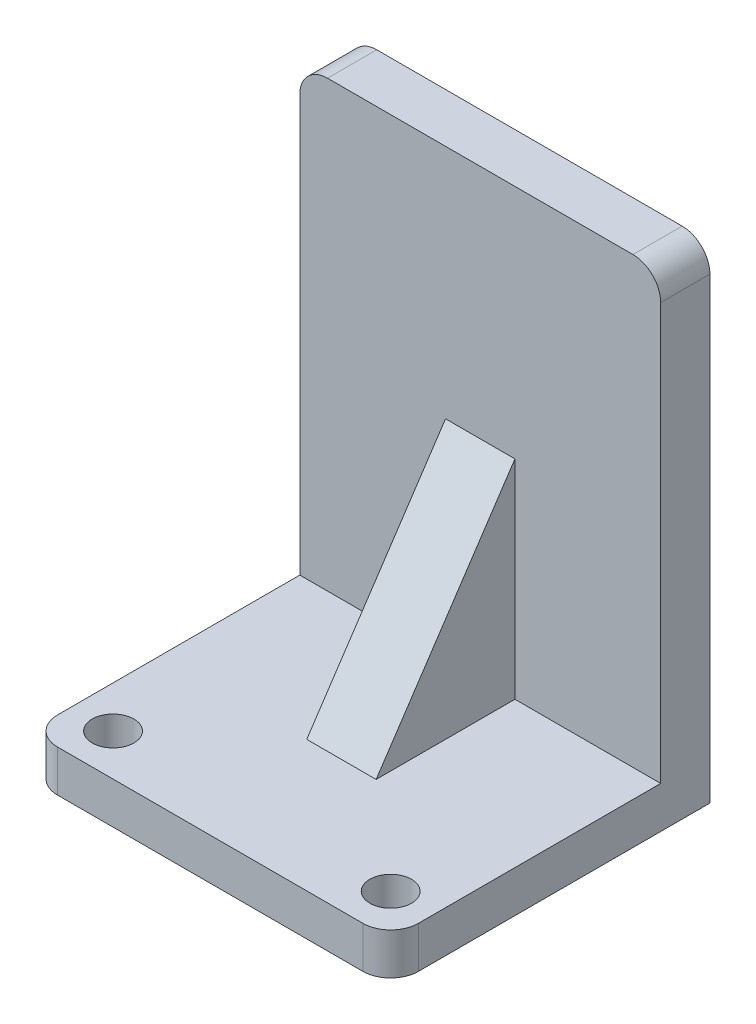
ISO-10303-21;
HEADER;
FILE_DESCRIPTION(('STEP AP214'),'2;1');
FILE_NAME('part.step','',(''),(''),'','','');
FILE_SCHEMA(('AUTOMOTIVE_DESIGN { 1 0 10303 214 1 1 1 1 }'));
ENDSEC;
DATA;
#1=APPLICATION_CONTEXT('core data for automotive mechanical design processes');
#2=APPLICATION_PROTOCOL_DEFINITION('international standard','automotive_design',2000,#1);
#3=PRODUCT_CONTEXT('',#1,'mechanical');
#4=PRODUCT('Part','Part','',(#3));
#5=PRODUCT_RELATED_PRODUCT_CATEGORY('part','',(#4));
#6=PRODUCT_DEFINITION_FORMATION('','',#4);
#7=PRODUCT_DEFINITION_CONTEXT('part definition',#1,'design');
#8=PRODUCT_DEFINITION('design','',#6,#7);
#9=PRODUCT_DEFINITION_SHAPE('','',#8);
#10=(LENGTH_UNIT() NAMED_UNIT(*) SI_UNIT(.MILLI.,.METRE.));
#11=(NAMED_UNIT(*) PLANE_ANGLE_UNIT() SI_UNIT($,.RADIAN.));
#12=(NAMED_UNIT(*) SI_UNIT($,.STERADIAN.) SOLID_ANGLE_UNIT());
#13=UNCERTAINTY_MEASURE_WITH_UNIT(LENGTH_MEASURE(1.E-05),#10,'distance_accuracy_value','');
#14=(GEOMETRIC_REPRESENTATION_CONTEXT(3) GLOBAL_UNCERTAINTY_ASSIGNED_CONTEXT((#13)) GLOBAL_UNIT_ASSIGNED_CONTEXT((#10,
#11,#12)) REPRESENTATION_CONTEXT('',''));
#15=CARTESIAN_POINT('',(0.,0.,0.));
#16=DIRECTION('',(0.,0.,1.));
#17=DIRECTION('',(1.,0.,0.));
#18=AXIS2_PLACEMENT_3D('',#15,#16,#17);
#19=CARTESIAN_POINT('',(11.0000000000015,3.,10.5000000000013));
#20=DIRECTION('',(0.,-1.00000000000007,0.));
#21=DIRECTION('',(0.,0.,-1.00000000000007));
#22=AXIS2_PLACEMENT_3D('',#19,#20,#21);
#23=PLANE('',#22);
#24=DIRECTION('',(-1.,0.,0.));
#25=VECTOR('',#24,1.);
#26=CARTESIAN_POINT('',(13.0000000000008,3.,-6.95354154770786));
#27=LINE('',#26,#25);
#28=CARTESIAN_POINT('',(13.0000000000008,3.,-6.95354154770786));
#29=VERTEX_POINT('',#28);
#30=CARTESIAN_POINT('',(2.50000000000178,2.99999999999578,-6.95354154770822));
#31=VERTEX_POINT('',#30);
#32=EDGE_CURVE('E145',#29,#31,#27,.T.);
#33=ORIENTED_EDGE('',*,*,#32,.T.);
#34=DIRECTION('',(0.,0.,1.00000000000007));
#35=VECTOR('',#34,1.);
#36=CARTESIAN_POINT('',(2.50000000000178,2.99999999999578,-6.95354154770822));
#37=LINE('',#36,#35);
#38=CARTESIAN_POINT('',(2.50000000000089,2.99999999999823,3.0464584522921));
#39=VERTEX_POINT('',#38);
#40=EDGE_CURVE('E131',#31,#39,#37,.T.);
#41=ORIENTED_EDGE('',*,*,#40,.T.);
#42=DIRECTION('',(-1.,0.,0.));
#43=VECTOR('',#42,1.);
#44=CARTESIAN_POINT('',(2.50000000000089,2.99999999999823,3.0464584522921));
#45=LINE('',#44,#43);
#46=CARTESIAN_POINT('',(-2.5,3.00000000000089,3.0464584522921));
#47=VERTEX_POINT('',#46);
#48=EDGE_CURVE('E318',#39,#47,#45,.T.);
#49=ORIENTED_EDGE('',*,*,#48,.T.);
#50=DIRECTION('',(0.,0.,1.00000000000007));
#51=VECTOR('',#50,1.);
#52=CARTESIAN_POINT('',(-2.49999999999995,2.99999999999845,-6.95354154770788));
#53=LINE('',#52,#51);
#54=CARTESIAN_POINT('',(-2.49999999999995,2.99999999999845,-6.95354154770788));
#55=VERTEX_POINT('',#54);
#56=EDGE_CURVE('E328',#55,#47,#53,.T.);
#57=ORIENTED_EDGE('',*,*,#56,.F.);
#58=CARTESIAN_POINT('',(-13.,2.99999999999734,-6.95354154770867));
#59=VERTEX_POINT('',#58);
#60=EDGE_CURVE('E158',#55,#59,#27,.T.);
#61=ORIENTED_EDGE('',*,*,#60,.T.);
#62=DIRECTION('',(0.,0.,1.00000000000007));
#63=VECTOR('',#62,1.);
#64=CARTESIAN_POINT('',(-13.,2.99999999999578,-10.5000000000007));
#65=LINE('',#64,#63);
#66=CARTESIAN_POINT('',(-12.9999999999971,3.,10.5000000000011));
#67=VERTEX_POINT('',#66);
#68=EDGE_CURVE('E191',#59,#67,#65,.T.);
#69=ORIENTED_EDGE('',*,*,#68,.T.);
#70=CARTESIAN_POINT('',(-10.9999999999971,3.,10.5000000000011));
#71=DIRECTION('',(0.,1.00000000000007,0.));
#72=DIRECTION('',(0.,0.,-1.00000000000007));
#73=AXIS2_PLACEMENT_3D('',#70,#71,#72);
#74=CIRCLE('',#73,2.);
#75=CARTESIAN_POINT('',(-10.9999999999992,3.,12.5000000000013));
#76=VERTEX_POINT('',#75);
#77=EDGE_CURVE('E195',#67,#76,#74,.T.);
#78=ORIENTED_EDGE('',*,*,#77,.T.);
#79=DIRECTION('',(1.,0.,0.));
#80=VECTOR('',#79,1.);
#81=CARTESIAN_POINT('',(11.0000000000018,2.99999999999906,12.5000000000014));
#82=LINE('',#81,#80);
#83=CARTESIAN_POINT('',(11.0000000000018,2.99999999999906,12.5000000000014));
#84=VERTEX_POINT('',#83);
#85=EDGE_CURVE('E198',#76,#84,#82,.T.);
#86=ORIENTED_EDGE('',*,*,#85,.T.);
#87=CARTESIAN_POINT('',(11.0000000000015,3.,10.5000000000013));
#88=DIRECTION('',(0.,1.00000000000007,0.));
#89=DIRECTION('',(0.,0.,-1.00000000000007));
#90=AXIS2_PLACEMENT_3D('',#87,#88,#89);
#91=CIRCLE('',#90,2.);
#92=CARTESIAN_POINT('',(13.0000000000015,3.00000000000267,10.5000000000022));
#93=VERTEX_POINT('',#92);
#94=EDGE_CURVE('E201',#84,#93,#91,.T.);
#95=ORIENTED_EDGE('',*,*,#94,.T.);
#96=DIRECTION('',(0.,0.,-1.00000000000007));
#97=VECTOR('',#96,1.);
#98=CARTESIAN_POINT('',(13.0000000000008,3.,-10.5000000000004));
#99=LINE('',#98,#97);
#100=EDGE_CURVE('E155',#93,#29,#99,.T.);
#101=ORIENTED_EDGE('',*,*,#100,.T.);
#102=EDGE_LOOP('',(#33,#41,#49,#57,#61,#69,#78,#86,#95,#101));
#103=FACE_BOUND('',#102,.T.);
#104=CARTESIAN_POINT('',(-9.99999999999834,3.00000000000267,9.50000000000052));
#105=DIRECTION('',(0.,1.00000000000007,0.));
#106=DIRECTION('',(0.,0.,1.00000000000007));
#107=AXIS2_PLACEMENT_3D('',#104,#105,#106);
#108=CIRCLE('',#107,1.5);
#109=CARTESIAN_POINT('',(-9.99999999999832,3.00000000000266,11.0000000000006));
#110=VERTEX_POINT('',#109);
#111=EDGE_CURVE('E181',#110,#110,#108,.T.);
#112=ORIENTED_EDGE('',*,*,#111,.F.);
#113=EDGE_LOOP('',(#112));
#114=FACE_BOUND('',#113,.T.);
#115=CARTESIAN_POINT('',(10.0000000000018,3.,9.50000000000129));
#116=DIRECTION('',(0.,1.00000000000007,0.));
#117=DIRECTION('',(0.,0.,1.00000000000007));
#118=AXIS2_PLACEMENT_3D('',#115,#116,#117);
#119=CIRCLE('',#118,1.5);
#120=CARTESIAN_POINT('',(10.0000000000018,2.99999999999999,11.0000000000014));
#121=VERTEX_POINT('',#120);
#122=EDGE_CURVE('E164',#121,#121,#119,.T.);
#123=ORIENTED_EDGE('',*,*,#122,.F.);
#124=EDGE_LOOP('',(#123));
#125=FACE_BOUND('',#124,.T.);
#126=ADVANCED_FACE('F36',(#103,#114,#125),#23,.F.);
#127=CARTESIAN_POINT('',(11.0000000000008,0.,10.5000000000012));
#128=DIRECTION('',(0.,-1.00000000000007,0.));
#129=DIRECTION('',(0.,0.,-1.00000000000007));
#130=AXIS2_PLACEMENT_3D('',#127,#128,#129);
#131=PLANE('',#130);
#132=CARTESIAN_POINT('',(-9.99999999999995,8.88178419700125E-13,9.50000000000068));
#133=DIRECTION('',(0.,1.00000000000007,0.));
#134=DIRECTION('',(0.,0.,1.00000000000007));
#135=AXIS2_PLACEMENT_3D('',#132,#133,#134);
#136=CIRCLE('',#135,1.5);
#137=CARTESIAN_POINT('',(-9.99999999999993,8.79284492438791E-13,11.0000000000008));
#138=VERTEX_POINT('',#137);
#139=EDGE_CURVE('E179',#138,#138,#136,.T.);
#140=ORIENTED_EDGE('',*,*,#139,.T.);
#141=EDGE_LOOP('',(#140));
#142=FACE_BOUND('',#141,.T.);
#143=DIRECTION('',(0.,0.,-1.00000000000007));
#144=VECTOR('',#143,1.);
#145=CARTESIAN_POINT('',(13.,0.,-10.5000000000006));
#146=LINE('',#145,#144);
#147=CARTESIAN_POINT('',(13.0000000000008,2.66453525910038E-12,10.5000000000019));
#148=VERTEX_POINT('',#147);
#149=CARTESIAN_POINT('',(13.,0.,-10.5000000000006));
#150=VERTEX_POINT('',#149);
#151=EDGE_CURVE('E185',#148,#150,#146,.T.);
#152=ORIENTED_EDGE('',*,*,#151,.F.);
#153=CARTESIAN_POINT('',(11.0000000000008,0.,10.5000000000012));
#154=DIRECTION('',(0.,1.00000000000007,0.));
#155=DIRECTION('',(0.,0.,-1.00000000000007));
#156=AXIS2_PLACEMENT_3D('',#153,#154,#155);
#157=CIRCLE('',#156,2.);
#158=CARTESIAN_POINT('',(11.0000000000009,-9.43689570931383E-13,12.5000000000013));
#159=VERTEX_POINT('',#158);
#160=EDGE_CURVE('E192',#159,#148,#157,.T.);
#161=ORIENTED_EDGE('',*,*,#160,.F.);
#162=DIRECTION('',(1.,0.,0.));
#163=VECTOR('',#162,1.);
#164=CARTESIAN_POINT('',(11.0000000000009,-9.43689570931383E-13,12.5000000000013));
#165=LINE('',#164,#163);
#166=CARTESIAN_POINT('',(-11.,0.,12.5000000000014));
#167=VERTEX_POINT('',#166);
#168=EDGE_CURVE('E218',#167,#159,#165,.T.);
#169=ORIENTED_EDGE('',*,*,#168,.F.);
#170=CARTESIAN_POINT('',(-10.9999999999983,0.,10.5000000000014));
#171=DIRECTION('',(0.,1.00000000000007,0.));
#172=DIRECTION('',(0.,0.,-1.00000000000007));
#173=AXIS2_PLACEMENT_3D('',#170,#171,#172);
#174=CIRCLE('',#173,2.);
#175=CARTESIAN_POINT('',(-12.9999999999983,0.,10.5000000000016));
#176=VERTEX_POINT('',#175);
#177=EDGE_CURVE('E215',#176,#167,#174,.T.);
#178=ORIENTED_EDGE('',*,*,#177,.F.);
#179=DIRECTION('',(0.,0.,1.00000000000007));
#180=VECTOR('',#179,1.);
#181=CARTESIAN_POINT('',(-13.0000000000017,-4.21884749357559E-12,-10.5000000000004));
#182=LINE('',#181,#180);
#183=CARTESIAN_POINT('',(-13.0000000000017,-4.21884749357559E-12,-10.5000000000004));
#184=VERTEX_POINT('',#183);
#185=EDGE_CURVE('E212',#184,#176,#182,.T.);
#186=ORIENTED_EDGE('',*,*,#185,.F.);
#187=DIRECTION('',(-1.,0.,0.));
#188=VECTOR('',#187,1.);
#189=CARTESIAN_POINT('',(13.,0.,-10.5000000000006));
#190=LINE('',#189,#188);
#191=EDGE_CURVE('E208',#150,#184,#190,.T.);
#192=ORIENTED_EDGE('',*,*,#191,.F.);
#193=EDGE_LOOP('',(#152,#161,#169,#178,#186,#192));
#194=FACE_BOUND('',#193,.T.);
#195=CARTESIAN_POINT('',(10.0000000000009,0.,9.50000000000142));
#196=DIRECTION('',(0.,1.00000000000007,0.));
#197=DIRECTION('',(0.,0.,1.00000000000007));
#198=AXIS2_PLACEMENT_3D('',#195,#196,#197);
#199=CIRCLE('',#198,1.5);
#200=CARTESIAN_POINT('',(10.0000000000009,0.,11.0000000000015));
#201=VERTEX_POINT('',#200);
#202=EDGE_CURVE('E157',#201,#201,#199,.T.);
#203=ORIENTED_EDGE('',*,*,#202,.T.);
#204=EDGE_LOOP('',(#203));
#205=FACE_BOUND('',#204,.T.);
#206=ADVANCED_FACE('F349',(#142,#194,#205),#131,.T.);
#207=CARTESIAN_POINT('',(13.0000000000008,3.,-10.5000000000004));
#208=DIRECTION('',(-1.,0.,0.));
#209=DIRECTION('',(0.,0.,1.00000000000007));
#210=AXIS2_PLACEMENT_3D('',#207,#208,#209);
#211=PLANE('',#210);
#212=DIRECTION('',(0.,-1.00000000000007,0.));
#213=VECTOR('',#212,1.);
#214=CARTESIAN_POINT('',(13.0000000000008,3.,-10.5000000000004));
#215=LINE('',#214,#213);
#216=CARTESIAN_POINT('',(13.,32.9999999999993,-10.5000000000004));
#217=VERTEX_POINT('',#216);
#218=EDGE_CURVE('E241',#217,#150,#215,.T.);
#219=ORIENTED_EDGE('',*,*,#218,.F.);
#220=DIRECTION('',(0.,0.,-1.00000000000007));
#221=VECTOR('',#220,1.);
#222=CARTESIAN_POINT('',(13.,33.,-6.95354154770762));
#223=LINE('',#222,#221);
#224=CARTESIAN_POINT('',(13.,33.,-6.95354154770762));
#225=VERTEX_POINT('',#224);
#226=EDGE_CURVE('E45',#217,#225,#223,.F.);
#227=ORIENTED_EDGE('',*,*,#226,.T.);
#228=DIRECTION('',(0.,1.00000000000007,0.));
#229=VECTOR('',#228,1.);
#230=CARTESIAN_POINT('',(13.0000000000008,3.,-6.95354154770786));
#231=LINE('',#230,#229);
#232=EDGE_CURVE('E176',#29,#225,#231,.T.);
#233=ORIENTED_EDGE('',*,*,#232,.F.);
#234=ORIENTED_EDGE('',*,*,#100,.F.);
#235=DIRECTION('',(0.,-1.00000000000007,0.));
#236=VECTOR('',#235,1.);
#237=CARTESIAN_POINT('',(13.0000000000015,3.00000000000267,10.5000000000022));
#238=LINE('',#237,#236);
#239=EDGE_CURVE('E204',#93,#148,#238,.T.);
#240=ORIENTED_EDGE('',*,*,#239,.T.);
#241=ORIENTED_EDGE('',*,*,#151,.T.);
#242=EDGE_LOOP('',(#219,#227,#233,#234,#240,#241));
#243=FACE_BOUND('',#242,.T.);
#244=ADVANCED_FACE('F354',(#243),#211,.F.);
#245=CARTESIAN_POINT('',(13.0000000000008,3.,-10.5000000000004));
#246=DIRECTION('',(0.,0.,1.00000000000007));
#247=DIRECTION('',(1.,0.,0.));
#248=AXIS2_PLACEMENT_3D('',#245,#246,#247);
#249=PLANE('',#248);
#250=DIRECTION('',(-1.,0.,0.));
#251=VECTOR('',#250,1.);
#252=CARTESIAN_POINT('',(13.000000000001,35.0000000000018,-10.5000000000006));
#253=LINE('',#252,#251);
#254=CARTESIAN_POINT('',(11.000000000001,35.0000000000018,-10.5));
#255=VERTEX_POINT('',#254);
#256=CARTESIAN_POINT('',(-10.9999999999992,35.0000000000018,-10.5000000000005));
#257=VERTEX_POINT('',#256);
#258=EDGE_CURVE('E166',#255,#257,#253,.T.);
#259=ORIENTED_EDGE('',*,*,#258,.F.);
#260=CARTESIAN_POINT('',(11.,33.0000000000009,-10.5000000000001));
#261=DIRECTION('',(0.,0.,1.00000000000007));
#262=DIRECTION('',(1.,0.,0.));
#263=AXIS2_PLACEMENT_3D('',#260,#261,#262);
#264=CIRCLE('',#263,2.);
#265=EDGE_CURVE('E59',#255,#217,#264,.F.);
#266=ORIENTED_EDGE('',*,*,#265,.T.);
#267=ORIENTED_EDGE('',*,*,#218,.T.);
#268=ORIENTED_EDGE('',*,*,#191,.T.);
#269=DIRECTION('',(0.,-1.00000000000007,0.));
#270=VECTOR('',#269,1.);
#271=CARTESIAN_POINT('',(-13.,2.99999999999578,-10.5000000000007));
#272=LINE('',#271,#270);
#273=CARTESIAN_POINT('',(-13.0000000000017,33.0000000000018,-10.5000000000012));
#274=VERTEX_POINT('',#273);
#275=EDGE_CURVE('E238',#274,#184,#272,.T.);
#276=ORIENTED_EDGE('',*,*,#275,.F.);
#277=CARTESIAN_POINT('',(-11.0000000000017,33.0000000000017,-10.5000000000007));
#278=DIRECTION('',(0.,0.,1.00000000000007));
#279=DIRECTION('',(1.,0.,0.));
#280=AXIS2_PLACEMENT_3D('',#277,#278,#279);
#281=CIRCLE('',#280,2.);
#282=EDGE_CURVE('E248',#274,#257,#281,.F.);
#283=ORIENTED_EDGE('',*,*,#282,.T.);
#284=EDGE_LOOP('',(#259,#266,#267,#268,#276,#283));
#285=FACE_BOUND('',#284,.T.);
#286=ADVANCED_FACE('F300',(#285),#249,.F.);
#287=CARTESIAN_POINT('',(-13.,2.99999999999578,-10.5000000000007));
#288=DIRECTION('',(1.,0.,0.));
#289=DIRECTION('',(0.,0.,-1.00000000000007));
#290=AXIS2_PLACEMENT_3D('',#287,#288,#289);
#291=PLANE('',#290);
#292=DIRECTION('',(0.,1.00000000000007,0.));
#293=VECTOR('',#292,1.);
#294=CARTESIAN_POINT('',(-13.,2.99999999999734,-6.95354154770867));
#295=LINE('',#294,#293);
#296=CARTESIAN_POINT('',(-13.0000000000017,33.,-6.95354154770799));
#297=VERTEX_POINT('',#296);
#298=EDGE_CURVE('E169',#59,#297,#295,.T.);
#299=ORIENTED_EDGE('',*,*,#298,.T.);
#300=DIRECTION('',(0.,0.,-1.00000000000007));
#301=VECTOR('',#300,1.);
#302=CARTESIAN_POINT('',(-13.0000000000017,33.0000000000018,-10.5000000000012));
#303=LINE('',#302,#301);
#304=EDGE_CURVE('E244',#297,#274,#303,.T.);
#305=ORIENTED_EDGE('',*,*,#304,.T.);
#306=ORIENTED_EDGE('',*,*,#275,.T.);
#307=ORIENTED_EDGE('',*,*,#185,.T.);
#308=DIRECTION('',(0.,-1.00000000000007,0.));
#309=VECTOR('',#308,1.);
#310=CARTESIAN_POINT('',(-12.9999999999971,3.,10.5000000000011));
#311=LINE('',#310,#309);
#312=EDGE_CURVE('E234',#67,#176,#311,.T.);
#313=ORIENTED_EDGE('',*,*,#312,.F.);
#314=ORIENTED_EDGE('',*,*,#68,.F.);
#315=EDGE_LOOP('',(#299,#305,#306,#307,#313,#314));
#316=FACE_BOUND('',#315,.T.);
#317=ADVANCED_FACE('F312',(#316),#291,.F.);
#318=CARTESIAN_POINT('',(-10.9999999999971,3.,10.5000000000011));
#319=DIRECTION('',(0.,-1.00000000000007,0.));
#320=DIRECTION('',(0.,0.,-1.00000000000007));
#321=AXIS2_PLACEMENT_3D('',#318,#319,#320);
#322=CYLINDRICAL_SURFACE('',#321,2.);
#323=ORIENTED_EDGE('',*,*,#177,.T.);
#324=DIRECTION('',(0.,-1.00000000000007,0.));
#325=VECTOR('',#324,1.);
#326=CARTESIAN_POINT('',(-10.9999999999992,3.,12.5000000000013));
#327=LINE('',#326,#325);
#328=EDGE_CURVE('E230',#76,#167,#327,.T.);
#329=ORIENTED_EDGE('',*,*,#328,.F.);
#330=ORIENTED_EDGE('',*,*,#77,.F.);
#331=ORIENTED_EDGE('',*,*,#312,.T.);
#332=EDGE_LOOP('',(#323,#329,#330,#331));
#333=FACE_BOUND('',#332,.T.);
#334=ADVANCED_FACE('F368',(#333),#322,.T.);
#335=CARTESIAN_POINT('',(11.0000000000018,2.99999999999906,12.5000000000014));
#336=DIRECTION('',(0.,0.,-1.00000000000007));
#337=DIRECTION('',(-1.,0.,0.));
#338=AXIS2_PLACEMENT_3D('',#335,#336,#337);
#339=PLANE('',#338);
#340=ORIENTED_EDGE('',*,*,#168,.T.);
#341=DIRECTION('',(0.,-1.00000000000007,0.));
#342=VECTOR('',#341,1.);
#343=CARTESIAN_POINT('',(11.0000000000018,2.99999999999906,12.5000000000014));
#344=LINE('',#343,#342);
#345=EDGE_CURVE('E226',#84,#159,#344,.T.);
#346=ORIENTED_EDGE('',*,*,#345,.F.);
#347=ORIENTED_EDGE('',*,*,#85,.F.);
#348=ORIENTED_EDGE('',*,*,#328,.T.);
#349=EDGE_LOOP('',(#340,#346,#347,#348));
#350=FACE_BOUND('',#349,.T.);
#351=ADVANCED_FACE('F364',(#350),#339,.F.);
#352=CARTESIAN_POINT('',(11.0000000000015,3.,10.5000000000013));
#353=DIRECTION('',(0.,-1.00000000000007,0.));
#354=DIRECTION('',(0.,0.,-1.00000000000007));
#355=AXIS2_PLACEMENT_3D('',#352,#353,#354);
#356=CYLINDRICAL_SURFACE('',#355,2.);
#357=ORIENTED_EDGE('',*,*,#160,.T.);
#358=ORIENTED_EDGE('',*,*,#239,.F.);
#359=ORIENTED_EDGE('',*,*,#94,.F.);
#360=ORIENTED_EDGE('',*,*,#345,.T.);
#361=EDGE_LOOP('',(#357,#358,#359,#360));
#362=FACE_BOUND('',#361,.T.);
#363=ADVANCED_FACE('F361',(#362),#356,.T.);
#364=CARTESIAN_POINT('',(-9.99999999999834,3.00000000000267,9.50000000000052));
#365=DIRECTION('',(0.,-1.00000000000007,0.));
#366=DIRECTION('',(0.,0.,-1.00000000000007));
#367=AXIS2_PLACEMENT_3D('',#364,#365,#366);
#368=CYLINDRICAL_SURFACE('',#367,1.5);
#369=ORIENTED_EDGE('',*,*,#111,.T.);
#370=EDGE_LOOP('',(#369));
#371=FACE_BOUND('',#370,.T.);
#372=ORIENTED_EDGE('',*,*,#139,.F.);
#373=EDGE_LOOP('',(#372));
#374=FACE_BOUND('',#373,.T.);
#375=ADVANCED_FACE('F358',(#371,#374),#368,.F.);
#376=CARTESIAN_POINT('',(10.0000000000018,3.,9.50000000000129));
#377=DIRECTION('',(0.,-1.00000000000007,0.));
#378=DIRECTION('',(0.,0.,-1.00000000000007));
#379=AXIS2_PLACEMENT_3D('',#376,#377,#378);
#380=CYLINDRICAL_SURFACE('',#379,1.5);
#381=ORIENTED_EDGE('',*,*,#122,.T.);
#382=EDGE_LOOP('',(#381));
#383=FACE_BOUND('',#382,.T.);
#384=ORIENTED_EDGE('',*,*,#202,.F.);
#385=EDGE_LOOP('',(#384));
#386=FACE_BOUND('',#385,.T.);
#387=ADVANCED_FACE('F396',(#383,#386),#380,.F.);
#388=CARTESIAN_POINT('',(13.0000000000008,3.,-6.95354154770786));
#389=DIRECTION('',(0.,0.,1.00000000000007));
#390=DIRECTION('',(1.,0.,0.));
#391=AXIS2_PLACEMENT_3D('',#388,#389,#390);
#392=PLANE('',#391);
#393=ORIENTED_EDGE('',*,*,#232,.T.);
#394=CARTESIAN_POINT('',(11.,33.,-6.95354154770762));
#395=DIRECTION('',(0.,0.,1.00000000000007));
#396=DIRECTION('',(1.,0.,0.));
#397=AXIS2_PLACEMENT_3D('',#394,#395,#396);
#398=CIRCLE('',#397,2.);
#399=CARTESIAN_POINT('',(11.0000000000001,35.0000000000018,-6.95354154770808));
#400=VERTEX_POINT('',#399);
#401=EDGE_CURVE('E11',#225,#400,#398,.T.);
#402=ORIENTED_EDGE('',*,*,#401,.T.);
#403=DIRECTION('',(-1.,0.,0.));
#404=VECTOR('',#403,1.);
#405=CARTESIAN_POINT('',(13.0000000000001,35.0000000000018,-6.95354154770771));
#406=LINE('',#405,#404);
#407=CARTESIAN_POINT('',(-11.0000000000001,35.0000000000018,-6.95354154770901));
#408=VERTEX_POINT('',#407);
#409=EDGE_CURVE('E173',#400,#408,#406,.T.);
#410=ORIENTED_EDGE('',*,*,#409,.T.);
#411=CARTESIAN_POINT('',(-11.0000000000017,33.,-6.95354154770879));
#412=DIRECTION('',(0.,0.,1.00000000000007));
#413=DIRECTION('',(1.,0.,0.));
#414=AXIS2_PLACEMENT_3D('',#411,#412,#413);
#415=CIRCLE('',#414,2.);
#416=EDGE_CURVE('E256',#408,#297,#415,.T.);
#417=ORIENTED_EDGE('',*,*,#416,.T.);
#418=ORIENTED_EDGE('',*,*,#298,.F.);
#419=ORIENTED_EDGE('',*,*,#60,.F.);
#420=DIRECTION('',(0.,-1.00000000000007,0.));
#421=VECTOR('',#420,1.);
#422=CARTESIAN_POINT('',(-2.49999999999995,2.99999999999845,-6.95354154770788));
#423=LINE('',#422,#421);
#424=CARTESIAN_POINT('',(-2.50000000000172,18.,-6.95354154770832));
#425=VERTEX_POINT('',#424);
#426=EDGE_CURVE('E331',#425,#55,#423,.T.);
#427=ORIENTED_EDGE('',*,*,#426,.F.);
#428=DIRECTION('',(-1.,0.,0.));
#429=VECTOR('',#428,1.);
#430=CARTESIAN_POINT('',(2.50000000000006,18.0000000000009,-6.95354154770832));
#431=LINE('',#430,#429);
#432=CARTESIAN_POINT('',(2.50000000000006,18.0000000000009,-6.95354154770832));
#433=VERTEX_POINT('',#432);
#434=EDGE_CURVE('E148',#433,#425,#431,.T.);
#435=ORIENTED_EDGE('',*,*,#434,.F.);
#436=DIRECTION('',(0.,-1.00000000000007,0.));
#437=VECTOR('',#436,1.);
#438=CARTESIAN_POINT('',(2.50000000000178,2.99999999999578,-6.95354154770822));
#439=LINE('',#438,#437);
#440=EDGE_CURVE('E134',#433,#31,#439,.T.);
#441=ORIENTED_EDGE('',*,*,#440,.T.);
#442=ORIENTED_EDGE('',*,*,#32,.F.);
#443=EDGE_LOOP('',(#393,#402,#410,#417,#418,#419,#427,#435,#441,#442));
#444=FACE_BOUND('',#443,.T.);
#445=ADVANCED_FACE('F144',(#444),#392,.T.);
#446=CARTESIAN_POINT('',(13.000000000001,35.0000000000018,-10.5000000000006));
#447=DIRECTION('',(0.,1.00000000000007,0.));
#448=DIRECTION('',(0.,0.,1.00000000000007));
#449=AXIS2_PLACEMENT_3D('',#446,#447,#448);
#450=PLANE('',#449);
#451=ORIENTED_EDGE('',*,*,#409,.F.);
#452=DIRECTION('',(0.,0.,-1.00000000000007));
#453=VECTOR('',#452,1.);
#454=CARTESIAN_POINT('',(11.000000000001,35.0000000000018,-10.5));
#455=LINE('',#454,#453);
#456=EDGE_CURVE('E259',#400,#255,#455,.T.);
#457=ORIENTED_EDGE('',*,*,#456,.T.);
#458=ORIENTED_EDGE('',*,*,#258,.T.);
#459=DIRECTION('',(0.,0.,-1.00000000000007));
#460=VECTOR('',#459,1.);
#461=CARTESIAN_POINT('',(-11.0000000000001,35.0000000000018,-6.95354154770901));
#462=LINE('',#461,#460);
#463=EDGE_CURVE('E252',#257,#408,#462,.F.);
#464=ORIENTED_EDGE('',*,*,#463,.T.);
#465=EDGE_LOOP('',(#451,#457,#458,#464));
#466=FACE_BOUND('',#465,.T.);
#467=ADVANCED_FACE('F297',(#466),#450,.T.);
#468=CARTESIAN_POINT('',(2.50000000000006,18.0000000000009,-6.95354154770832));
#469=DIRECTION('',(0.,0.554700196225254,0.832050294337914));
#470=DIRECTION('',(0.,-0.832050294337914,0.554700196225275));
#471=AXIS2_PLACEMENT_3D('',#468,#469,#470);
#472=PLANE('',#471);
#473=DIRECTION('',(0.,0.832050294337914,-0.554700196225275));
#474=VECTOR('',#473,1.);
#475=CARTESIAN_POINT('',(-2.50000000000172,18.,-6.95354154770832));
#476=LINE('',#475,#474);
#477=EDGE_CURVE('E150',#47,#425,#476,.T.);
#478=ORIENTED_EDGE('',*,*,#477,.F.);
#479=ORIENTED_EDGE('',*,*,#48,.F.);
#480=DIRECTION('',(0.,0.832050294337914,-0.554700196225275));
#481=VECTOR('',#480,1.);
#482=CARTESIAN_POINT('',(2.50000000000006,18.0000000000009,-6.95354154770832));
#483=LINE('',#482,#481);
#484=EDGE_CURVE('E136',#39,#433,#483,.T.);
#485=ORIENTED_EDGE('',*,*,#484,.T.);
#486=ORIENTED_EDGE('',*,*,#434,.T.);
#487=EDGE_LOOP('',(#478,#479,#485,#486));
#488=FACE_BOUND('',#487,.T.);
#489=ADVANCED_FACE('F336',(#488),#472,.T.);
#490=CARTESIAN_POINT('',(2.50000000000006,-1.66533453693773E-12,-2.28983498828939E-13));
#491=DIRECTION('',(1.,0.,0.));
#492=DIRECTION('',(0.,0.,-1.00000000000007));
#493=AXIS2_PLACEMENT_3D('',#490,#491,#492);
#494=PLANE('',#493);
#495=ORIENTED_EDGE('',*,*,#440,.F.);
#496=ORIENTED_EDGE('',*,*,#484,.F.);
#497=ORIENTED_EDGE('',*,*,#40,.F.);
#498=EDGE_LOOP('',(#495,#496,#497));
#499=FACE_BOUND('',#498,.T.);
#500=ADVANCED_FACE('F133',(#499),#494,.T.);
#501=CARTESIAN_POINT('',(-2.50000000000011,8.88178419700125E-13,0.));
#502=DIRECTION('',(1.,0.,0.));
#503=DIRECTION('',(0.,0.,-1.00000000000007));
#504=AXIS2_PLACEMENT_3D('',#501,#502,#503);
#505=PLANE('',#504);
#506=ORIENTED_EDGE('',*,*,#426,.T.);
#507=ORIENTED_EDGE('',*,*,#56,.T.);
#508=ORIENTED_EDGE('',*,*,#477,.T.);
#509=EDGE_LOOP('',(#506,#507,#508));
#510=FACE_BOUND('',#509,.T.);
#511=ADVANCED_FACE('F339',(#510),#505,.F.);
#512=CARTESIAN_POINT('',(-11.0000000000017,33.0000000000017,-10.5000000000007));
#513=DIRECTION('',(0.,0.,1.00000000000007));
#514=DIRECTION('',(1.,0.,0.));
#515=AXIS2_PLACEMENT_3D('',#512,#513,#514);
#516=CYLINDRICAL_SURFACE('',#515,2.);
#517=ORIENTED_EDGE('',*,*,#416,.F.);
#518=ORIENTED_EDGE('',*,*,#463,.F.);
#519=ORIENTED_EDGE('',*,*,#282,.F.);
#520=ORIENTED_EDGE('',*,*,#304,.F.);
#521=EDGE_LOOP('',(#517,#518,#519,#520));
#522=FACE_BOUND('',#521,.T.);
#523=ADVANCED_FACE('F306',(#522),#516,.T.);
#524=CARTESIAN_POINT('',(11.,33.0000000000009,-10.5000000000001));
#525=DIRECTION('',(0.,0.,1.00000000000007));
#526=DIRECTION('',(1.,0.,0.));
#527=AXIS2_PLACEMENT_3D('',#524,#525,#526);
#528=CYLINDRICAL_SURFACE('',#527,2.);
#529=ORIENTED_EDGE('',*,*,#401,.F.);
#530=ORIENTED_EDGE('',*,*,#226,.F.);
#531=ORIENTED_EDGE('',*,*,#265,.F.);
#532=ORIENTED_EDGE('',*,*,#456,.F.);
#533=EDGE_LOOP('',(#529,#530,#531,#532));
#534=FACE_BOUND('',#533,.T.);
#535=ADVANCED_FACE('F38',(#534),#528,.T.);
#536=CLOSED_SHELL('',(#126,#206,#244,#286,#317,#334,#351,#363,#375,#387,#445,#467,#489,#500,
#511,#523,#535));
#537=MANIFOLD_SOLID_BREP('B2',#536);
#538=ADVANCED_BREP_SHAPE_REPRESENTATION('',(#18,#537),#14);
#539=SHAPE_DEFINITION_REPRESENTATION(#9,#538);
ENDSEC;
END-ISO-10303-21;
